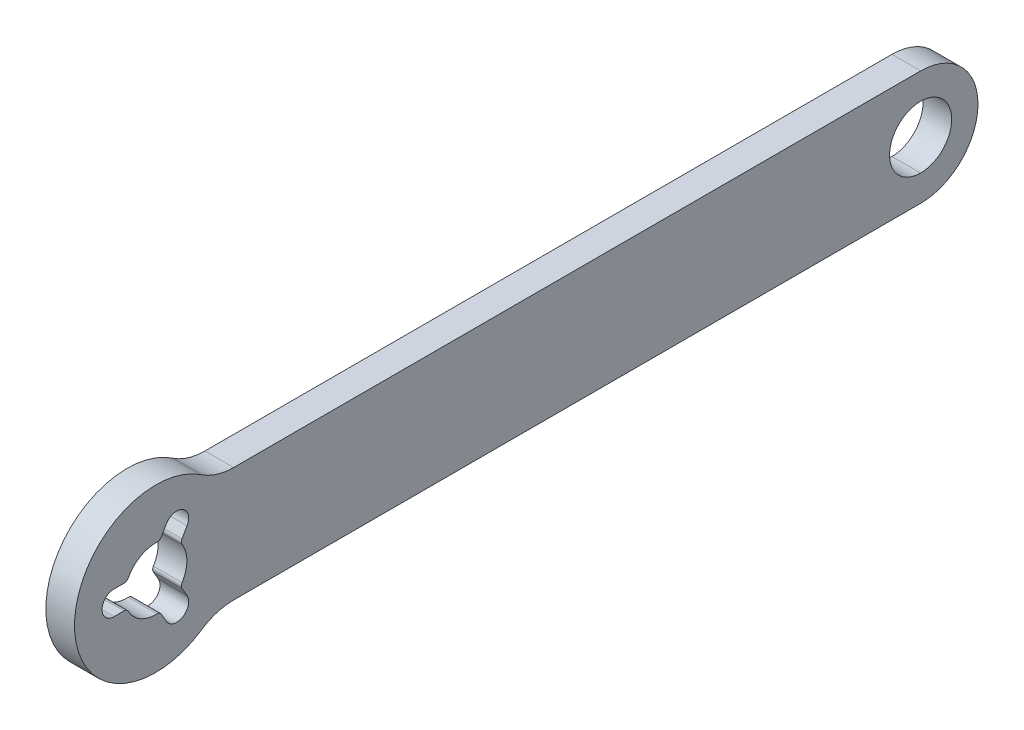
ISO-10303-21;
HEADER;
FILE_DESCRIPTION(('STEP AP214'),'2;1');
FILE_NAME('part.step','',(''),(''),'','','');
FILE_SCHEMA(('AUTOMOTIVE_DESIGN { 1 0 10303 214 1 1 1 1 }'));
ENDSEC;
DATA;
#1=APPLICATION_CONTEXT('core data for automotive mechanical design processes');
#2=APPLICATION_PROTOCOL_DEFINITION('international standard','automotive_design',2000,#1);
#3=PRODUCT_CONTEXT('',#1,'mechanical');
#4=PRODUCT('Part','Part','',(#3));
#5=PRODUCT_RELATED_PRODUCT_CATEGORY('part','',(#4));
#6=PRODUCT_DEFINITION_FORMATION('','',#4);
#7=PRODUCT_DEFINITION_CONTEXT('part definition',#1,'design');
#8=PRODUCT_DEFINITION('design','',#6,#7);
#9=PRODUCT_DEFINITION_SHAPE('','',#8);
#10=(LENGTH_UNIT() NAMED_UNIT(*) SI_UNIT(.MILLI.,.METRE.));
#11=(NAMED_UNIT(*) PLANE_ANGLE_UNIT() SI_UNIT($,.RADIAN.));
#12=(NAMED_UNIT(*) SI_UNIT($,.STERADIAN.) SOLID_ANGLE_UNIT());
#13=UNCERTAINTY_MEASURE_WITH_UNIT(LENGTH_MEASURE(1.E-05),#10,'distance_accuracy_value','');
#14=(GEOMETRIC_REPRESENTATION_CONTEXT(3) GLOBAL_UNCERTAINTY_ASSIGNED_CONTEXT((#13)) GLOBAL_UNIT_ASSIGNED_CONTEXT((#10,
#11,#12)) REPRESENTATION_CONTEXT('',''));
#15=CARTESIAN_POINT('',(0.,0.,0.));
#16=DIRECTION('',(0.,0.,1.));
#17=DIRECTION('',(1.,0.,0.));
#18=AXIS2_PLACEMENT_3D('',#15,#16,#17);
#19=CARTESIAN_POINT('',(-3.,0.,0.));
#20=DIRECTION('',(-1.,0.,0.));
#21=DIRECTION('',(0.,0.,-1.));
#22=AXIS2_PLACEMENT_3D('',#19,#20,#21);
#23=CYLINDRICAL_SURFACE('',#22,6.5);
#24=CARTESIAN_POINT('',(-3.,0.,0.));
#25=DIRECTION('',(1.,0.,0.));
#26=DIRECTION('',(0.,-0.532608352871737,-0.846361827146791));
#27=AXIS2_PLACEMENT_3D('',#24,#25,#26);
#28=CIRCLE('',#27,6.5);
#29=CARTESIAN_POINT('',(-3.,-3.46195429366629,-5.50135187645414));
#30=VERTEX_POINT('',#29);
#31=CARTESIAN_POINT('',(-3.,3.46195429366629,-5.50135187645415));
#32=VERTEX_POINT('',#31);
#33=EDGE_CURVE('E54',#30,#32,#28,.T.);
#34=ORIENTED_EDGE('',*,*,#33,.F.);
#35=DIRECTION('',(1.,0.,0.));
#36=VECTOR('',#35,1.);
#37=CARTESIAN_POINT('',(-3.,-3.46195429366629,-5.50135187645414));
#38=LINE('',#37,#36);
#39=CARTESIAN_POINT('',(3.,-3.46195429366629,-5.50135187645414));
#40=VERTEX_POINT('',#39);
#41=EDGE_CURVE('E11',#30,#40,#38,.T.);
#42=ORIENTED_EDGE('',*,*,#41,.T.);
#43=CARTESIAN_POINT('',(3.,0.,0.));
#44=DIRECTION('',(-1.,0.,0.));
#45=DIRECTION('',(0.,0.532608352871737,-0.846361827146792));
#46=AXIS2_PLACEMENT_3D('',#43,#44,#45);
#47=CIRCLE('',#46,6.5);
#48=CARTESIAN_POINT('',(3.,3.46195429366629,-5.50135187645415));
#49=VERTEX_POINT('',#48);
#50=EDGE_CURVE('E244',#49,#40,#47,.T.);
#51=ORIENTED_EDGE('',*,*,#50,.F.);
#52=DIRECTION('',(-1.,0.,0.));
#53=VECTOR('',#52,1.);
#54=CARTESIAN_POINT('',(3.,3.46195429366629,-5.50135187645415));
#55=LINE('',#54,#53);
#56=EDGE_CURVE('E437',#49,#32,#55,.T.);
#57=ORIENTED_EDGE('',*,*,#56,.T.);
#58=EDGE_LOOP('',(#34,#42,#51,#57));
#59=FACE_BOUND('',#58,.T.);
#60=ADVANCED_FACE('F51',(#59),#23,.F.);
#61=CARTESIAN_POINT('',(-10.8216,-3.99456264653803,-6.34771370360093));
#62=DIRECTION('',(1.,0.,0.));
#63=DIRECTION('',(0.,0.532608352871736,0.846361827146792));
#64=AXIS2_PLACEMENT_3D('',#61,#62,#63);
#65=CYLINDRICAL_SURFACE('',#64,1.);
#66=ORIENTED_EDGE('',*,*,#41,.F.);
#67=CARTESIAN_POINT('',(-3.,-3.99456264653803,-6.34771370360093));
#68=DIRECTION('',(-1.,0.,0.));
#69=DIRECTION('',(0.,-0.499999999999998,0.86602540378444));
#70=AXIS2_PLACEMENT_3D('',#67,#68,#69);
#71=CIRCLE('',#70,1.);
#72=CARTESIAN_POINT('',(-3.,-4.49456264653803,-5.48168829981649));
#73=VERTEX_POINT('',#72);
#74=EDGE_CURVE('E261',#73,#30,#71,.T.);
#75=ORIENTED_EDGE('',*,*,#74,.F.);
#76=DIRECTION('',(1.,0.,0.));
#77=VECTOR('',#76,1.);
#78=CARTESIAN_POINT('',(-3.,-4.49456264653803,-5.4816882998165));
#79=LINE('',#78,#77);
#80=CARTESIAN_POINT('',(3.,-4.49456264653803,-5.48168829981649));
#81=VERTEX_POINT('',#80);
#82=EDGE_CURVE('E60',#73,#81,#79,.T.);
#83=ORIENTED_EDGE('',*,*,#82,.T.);
#84=CARTESIAN_POINT('',(3.,-3.99456264653803,-6.34771370360093));
#85=DIRECTION('',(1.,0.,0.));
#86=DIRECTION('',(0.,0.532608352871737,0.846361827146792));
#87=AXIS2_PLACEMENT_3D('',#84,#85,#86);
#88=CIRCLE('',#87,1.);
#89=EDGE_CURVE('E427',#40,#81,#88,.T.);
#90=ORIENTED_EDGE('',*,*,#89,.F.);
#91=EDGE_LOOP('',(#66,#75,#83,#90));
#92=FACE_BOUND('',#91,.T.);
#93=ADVANCED_FACE('F522',(#92),#65,.T.);
#94=CARTESIAN_POINT('',(3.,-6.32772228311384,-6.54006350946109));
#95=DIRECTION('',(0.,0.5,-0.866025403784439));
#96=DIRECTION('',(0.,0.866025403784439,0.5));
#97=AXIS2_PLACEMENT_3D('',#94,#95,#96);
#98=PLANE('',#97);
#99=DIRECTION('',(0.,0.866025403784439,0.5));
#100=VECTOR('',#99,1.);
#101=CARTESIAN_POINT('',(-3.,-6.32772228311384,-6.5400635094611));
#102=LINE('',#101,#100);
#103=CARTESIAN_POINT('',(-3.,-6.32772228311384,-6.5400635094611));
#104=VERTEX_POINT('',#103);
#105=EDGE_CURVE('E265',#104,#73,#102,.T.);
#106=ORIENTED_EDGE('',*,*,#105,.F.);
#107=DIRECTION('',(-1.,0.,0.));
#108=VECTOR('',#107,1.);
#109=CARTESIAN_POINT('',(3.,-6.32772228311384,-6.5400635094611));
#110=LINE('',#109,#108);
#111=CARTESIAN_POINT('',(3.,-6.32772228311384,-6.5400635094611));
#112=VERTEX_POINT('',#111);
#113=EDGE_CURVE('E496',#112,#104,#110,.T.);
#114=ORIENTED_EDGE('',*,*,#113,.F.);
#115=DIRECTION('',(0.,0.866025403784439,0.499999999999999));
#116=VECTOR('',#115,1.);
#117=CARTESIAN_POINT('',(3.,-6.32772228311385,-6.5400635094611));
#118=LINE('',#117,#116);
#119=EDGE_CURVE('E423',#112,#81,#118,.T.);
#120=ORIENTED_EDGE('',*,*,#119,.T.);
#121=ORIENTED_EDGE('',*,*,#82,.F.);
#122=EDGE_LOOP('',(#106,#114,#120,#121));
#123=FACE_BOUND('',#122,.T.);
#124=ADVANCED_FACE('F525',(#123),#98,.F.);
#125=CARTESIAN_POINT('',(3.,-7.57772228311384,-4.375));
#126=DIRECTION('',(1.,0.,0.));
#127=DIRECTION('',(0.,-0.866025403784439,-0.5));
#128=AXIS2_PLACEMENT_3D('',#125,#126,#127);
#129=CYLINDRICAL_SURFACE('',#128,2.5);
#130=DIRECTION('',(-1.,0.,0.));
#131=VECTOR('',#130,1.);
#132=CARTESIAN_POINT('',(3.,-8.82772228311384,-2.2099364905389));
#133=LINE('',#132,#131);
#134=CARTESIAN_POINT('',(3.,-8.82772228311384,-2.2099364905389));
#135=VERTEX_POINT('',#134);
#136=CARTESIAN_POINT('',(-3.,-8.82772228311384,-2.2099364905389));
#137=VERTEX_POINT('',#136);
#138=EDGE_CURVE('E492',#135,#137,#133,.T.);
#139=ORIENTED_EDGE('',*,*,#138,.F.);
#140=CARTESIAN_POINT('',(3.,-7.57772228311384,-4.375));
#141=DIRECTION('',(1.,0.,0.));
#142=DIRECTION('',(0.,-0.5,0.866025403784439));
#143=AXIS2_PLACEMENT_3D('',#140,#141,#142);
#144=CIRCLE('',#143,2.5);
#145=EDGE_CURVE('E419',#135,#112,#144,.T.);
#146=ORIENTED_EDGE('',*,*,#145,.T.);
#147=ORIENTED_EDGE('',*,*,#113,.T.);
#148=CARTESIAN_POINT('',(-3.,-7.57772228311384,-4.375));
#149=DIRECTION('',(1.,0.,0.));
#150=DIRECTION('',(0.,-0.5,0.866025403784438));
#151=AXIS2_PLACEMENT_3D('',#148,#149,#150);
#152=CIRCLE('',#151,2.5);
#153=EDGE_CURVE('E269',#137,#104,#152,.T.);
#154=ORIENTED_EDGE('',*,*,#153,.F.);
#155=EDGE_LOOP('',(#139,#146,#147,#154));
#156=FACE_BOUND('',#155,.T.);
#157=ADVANCED_FACE('F529',(#156),#129,.F.);
#158=CARTESIAN_POINT('',(3.,-6.44615242270663,-0.834936490538902));
#159=DIRECTION('',(0.,-0.5,0.866025403784439));
#160=DIRECTION('',(0.,-0.866025403784439,-0.5));
#161=AXIS2_PLACEMENT_3D('',#158,#159,#160);
#162=PLANE('',#161);
#163=DIRECTION('',(0.,-0.866025403784439,-0.5));
#164=VECTOR('',#163,1.);
#165=CARTESIAN_POINT('',(3.,-6.99456264653803,-1.1515612808943));
#166=LINE('',#165,#164);
#167=CARTESIAN_POINT('',(3.,-6.99456264653803,-1.1515612808943));
#168=VERTEX_POINT('',#167);
#169=EDGE_CURVE('E415',#168,#135,#166,.T.);
#170=ORIENTED_EDGE('',*,*,#169,.T.);
#171=ORIENTED_EDGE('',*,*,#138,.T.);
#172=DIRECTION('',(0.,-0.866025403784439,-0.5));
#173=VECTOR('',#172,1.);
#174=CARTESIAN_POINT('',(-3.,-6.99456264653803,-1.1515612808943));
#175=LINE('',#174,#173);
#176=CARTESIAN_POINT('',(-3.,-6.99456264653803,-1.1515612808943));
#177=VERTEX_POINT('',#176);
#178=EDGE_CURVE('E273',#177,#137,#175,.T.);
#179=ORIENTED_EDGE('',*,*,#178,.F.);
#180=DIRECTION('',(-1.,0.,0.));
#181=VECTOR('',#180,1.);
#182=CARTESIAN_POINT('',(3.,-6.99456264653803,-1.1515612808943));
#183=LINE('',#182,#181);
#184=EDGE_CURVE('E480',#168,#177,#183,.T.);
#185=ORIENTED_EDGE('',*,*,#184,.F.);
#186=EDGE_LOOP('',(#170,#171,#179,#185));
#187=FACE_BOUND('',#186,.T.);
#188=ADVANCED_FACE('F531',(#187),#162,.F.);
#189=CARTESIAN_POINT('',(10.8216,-7.49456264653803,-0.285535877109864));
#190=DIRECTION('',(-1.,0.,0.));
#191=DIRECTION('',(0.,0.999275019538404,0.0380714502813137));
#192=AXIS2_PLACEMENT_3D('',#189,#190,#191);
#193=CYLINDRICAL_SURFACE('',#192,1.);
#194=DIRECTION('',(-1.,0.,0.));
#195=VECTOR('',#194,1.);
#196=CARTESIAN_POINT('',(3.,-6.49528762699963,-0.24746442682855));
#197=LINE('',#196,#195);
#198=CARTESIAN_POINT('',(3.,-6.49528762699963,-0.247464426828549));
#199=VERTEX_POINT('',#198);
#200=CARTESIAN_POINT('',(-3.,-6.49528762699963,-0.247464426828549));
#201=VERTEX_POINT('',#200);
#202=EDGE_CURVE('E476',#199,#201,#197,.T.);
#203=ORIENTED_EDGE('',*,*,#202,.F.);
#204=CARTESIAN_POINT('',(3.,-7.49456264653803,-0.285535877109864));
#205=DIRECTION('',(1.,0.,0.));
#206=DIRECTION('',(0.,0.499999999999999,-0.866025403784439));
#207=AXIS2_PLACEMENT_3D('',#204,#205,#206);
#208=CIRCLE('',#207,1.);
#209=EDGE_CURVE('E411',#168,#199,#208,.T.);
#210=ORIENTED_EDGE('',*,*,#209,.F.);
#211=ORIENTED_EDGE('',*,*,#184,.T.);
#212=CARTESIAN_POINT('',(-3.,-7.49456264653803,-0.285535877109864));
#213=DIRECTION('',(-1.,0.,0.));
#214=DIRECTION('',(0.,0.999275019538404,0.0380714502813151));
#215=AXIS2_PLACEMENT_3D('',#212,#213,#214);
#216=CIRCLE('',#215,1.);
#217=EDGE_CURVE('E277',#201,#177,#216,.T.);
#218=ORIENTED_EDGE('',*,*,#217,.F.);
#219=EDGE_LOOP('',(#203,#210,#211,#218));
#220=FACE_BOUND('',#219,.T.);
#221=ADVANCED_FACE('F534',(#220),#193,.T.);
#222=CARTESIAN_POINT('',(-3.,0.,0.));
#223=DIRECTION('',(-1.,0.,0.));
#224=DIRECTION('',(0.,0.,-1.));
#225=AXIS2_PLACEMENT_3D('',#222,#223,#224);
#226=CYLINDRICAL_SURFACE('',#225,6.5);
#227=CARTESIAN_POINT('',(-3.,0.,0.));
#228=DIRECTION('',(1.,0.,0.));
#229=DIRECTION('',(0.,-0.466666666666667,0.884433277428107));
#230=AXIS2_PLACEMENT_3D('',#227,#228,#229);
#231=CIRCLE('',#230,6.5);
#232=CARTESIAN_POINT('',(-3.,-3.03333333333333,5.74881630328269));
#233=VERTEX_POINT('',#232);
#234=EDGE_CURVE('E281',#233,#201,#231,.T.);
#235=ORIENTED_EDGE('',*,*,#234,.F.);
#236=DIRECTION('',(1.,0.,0.));
#237=VECTOR('',#236,1.);
#238=CARTESIAN_POINT('',(-3.,-3.03333333333333,5.74881630328269));
#239=LINE('',#238,#237);
#240=CARTESIAN_POINT('',(3.,-3.03333333333333,5.74881630328269));
#241=VERTEX_POINT('',#240);
#242=EDGE_CURVE('E472',#233,#241,#239,.T.);
#243=ORIENTED_EDGE('',*,*,#242,.T.);
#244=CARTESIAN_POINT('',(3.,0.,0.));
#245=DIRECTION('',(-1.,0.,0.));
#246=DIRECTION('',(0.,-0.999275019538404,-0.0380714502813152));
#247=AXIS2_PLACEMENT_3D('',#244,#245,#246);
#248=CIRCLE('',#247,6.5);
#249=EDGE_CURVE('E410',#199,#241,#248,.T.);
#250=ORIENTED_EDGE('',*,*,#249,.F.);
#251=ORIENTED_EDGE('',*,*,#202,.T.);
#252=EDGE_LOOP('',(#235,#243,#250,#251));
#253=FACE_BOUND('',#252,.T.);
#254=ADVANCED_FACE('F539',(#253),#226,.F.);
#255=CARTESIAN_POINT('',(-10.8216,-3.5,6.6332495807108));
#256=DIRECTION('',(1.,0.,0.));
#257=DIRECTION('',(0.,0.466666666666667,-0.884433277428106));
#258=AXIS2_PLACEMENT_3D('',#255,#256,#257);
#259=CYLINDRICAL_SURFACE('',#258,1.);
#260=ORIENTED_EDGE('',*,*,#242,.F.);
#261=CARTESIAN_POINT('',(-3.,-3.5,6.6332495807108));
#262=DIRECTION('',(-1.,0.,0.));
#263=DIRECTION('',(0.,1.,0.));
#264=AXIS2_PLACEMENT_3D('',#261,#262,#263);
#265=CIRCLE('',#264,1.);
#266=CARTESIAN_POINT('',(-3.,-2.5,6.6332495807108));
#267=VERTEX_POINT('',#266);
#268=EDGE_CURVE('E282',#267,#233,#265,.T.);
#269=ORIENTED_EDGE('',*,*,#268,.F.);
#270=DIRECTION('',(1.,0.,0.));
#271=VECTOR('',#270,1.);
#272=CARTESIAN_POINT('',(-3.,-2.5,6.6332495807108));
#273=LINE('',#272,#271);
#274=CARTESIAN_POINT('',(3.,-2.5,6.6332495807108));
#275=VERTEX_POINT('',#274);
#276=EDGE_CURVE('E469',#267,#275,#273,.T.);
#277=ORIENTED_EDGE('',*,*,#276,.T.);
#278=CARTESIAN_POINT('',(3.,-3.5,6.6332495807108));
#279=DIRECTION('',(1.,0.,0.));
#280=DIRECTION('',(0.,0.466666666666666,-0.884433277428107));
#281=AXIS2_PLACEMENT_3D('',#278,#279,#280);
#282=CIRCLE('',#281,1.);
#283=EDGE_CURVE('E406',#241,#275,#282,.T.);
#284=ORIENTED_EDGE('',*,*,#283,.F.);
#285=EDGE_LOOP('',(#260,#269,#277,#284));
#286=FACE_BOUND('',#285,.T.);
#287=ADVANCED_FACE('F542',(#286),#259,.T.);
#288=CARTESIAN_POINT('',(3.,-2.5,8.75));
#289=DIRECTION('',(0.,-1.,0.));
#290=DIRECTION('',(0.,0.,-1.));
#291=AXIS2_PLACEMENT_3D('',#288,#289,#290);
#292=PLANE('',#291);
#293=DIRECTION('',(0.,0.,-1.));
#294=VECTOR('',#293,1.);
#295=CARTESIAN_POINT('',(-3.,-2.5,8.75));
#296=LINE('',#295,#294);
#297=CARTESIAN_POINT('',(-3.,-2.5,8.75));
#298=VERTEX_POINT('',#297);
#299=EDGE_CURVE('E286',#298,#267,#296,.T.);
#300=ORIENTED_EDGE('',*,*,#299,.F.);
#301=DIRECTION('',(-1.,0.,0.));
#302=VECTOR('',#301,1.);
#303=CARTESIAN_POINT('',(3.,-2.5,8.75));
#304=LINE('',#303,#302);
#305=CARTESIAN_POINT('',(3.,-2.5,8.75));
#306=VERTEX_POINT('',#305);
#307=EDGE_CURVE('E468',#306,#298,#304,.T.);
#308=ORIENTED_EDGE('',*,*,#307,.F.);
#309=DIRECTION('',(0.,0.,-1.));
#310=VECTOR('',#309,1.);
#311=CARTESIAN_POINT('',(3.,-2.5,8.75));
#312=LINE('',#311,#310);
#313=EDGE_CURVE('E402',#306,#275,#312,.T.);
#314=ORIENTED_EDGE('',*,*,#313,.T.);
#315=ORIENTED_EDGE('',*,*,#276,.F.);
#316=EDGE_LOOP('',(#300,#308,#314,#315));
#317=FACE_BOUND('',#316,.T.);
#318=ADVANCED_FACE('F545',(#317),#292,.F.);
#319=CARTESIAN_POINT('',(3.,0.,8.75));
#320=DIRECTION('',(1.,0.,0.));
#321=DIRECTION('',(0.,0.,1.));
#322=AXIS2_PLACEMENT_3D('',#319,#320,#321);
#323=CYLINDRICAL_SURFACE('',#322,2.5);
#324=DIRECTION('',(-1.,0.,0.));
#325=VECTOR('',#324,1.);
#326=CARTESIAN_POINT('',(3.,2.5,8.75));
#327=LINE('',#326,#325);
#328=CARTESIAN_POINT('',(3.,2.5,8.75));
#329=VERTEX_POINT('',#328);
#330=CARTESIAN_POINT('',(-3.,2.5,8.75));
#331=VERTEX_POINT('',#330);
#332=EDGE_CURVE('E464',#329,#331,#327,.T.);
#333=ORIENTED_EDGE('',*,*,#332,.F.);
#334=CARTESIAN_POINT('',(3.,0.,8.75));
#335=DIRECTION('',(1.,0.,0.));
#336=DIRECTION('',(0.,1.,0.));
#337=AXIS2_PLACEMENT_3D('',#334,#335,#336);
#338=CIRCLE('',#337,2.5);
#339=EDGE_CURVE('E398',#329,#306,#338,.T.);
#340=ORIENTED_EDGE('',*,*,#339,.T.);
#341=ORIENTED_EDGE('',*,*,#307,.T.);
#342=CARTESIAN_POINT('',(-3.,0.,8.75));
#343=DIRECTION('',(1.,0.,0.));
#344=DIRECTION('',(0.,1.,0.));
#345=AXIS2_PLACEMENT_3D('',#342,#343,#344);
#346=CIRCLE('',#345,2.5);
#347=EDGE_CURVE('E290',#331,#298,#346,.T.);
#348=ORIENTED_EDGE('',*,*,#347,.F.);
#349=EDGE_LOOP('',(#333,#340,#341,#348));
#350=FACE_BOUND('',#349,.T.);
#351=ADVANCED_FACE('F549',(#350),#323,.F.);
#352=CARTESIAN_POINT('',(3.,2.5,6.));
#353=DIRECTION('',(0.,1.,0.));
#354=DIRECTION('',(0.,0.,1.));
#355=AXIS2_PLACEMENT_3D('',#352,#353,#354);
#356=PLANE('',#355);
#357=DIRECTION('',(0.,0.,1.));
#358=VECTOR('',#357,1.);
#359=CARTESIAN_POINT('',(3.,2.5,6.6332495807108));
#360=LINE('',#359,#358);
#361=CARTESIAN_POINT('',(3.,2.5,6.6332495807108));
#362=VERTEX_POINT('',#361);
#363=EDGE_CURVE('E394',#362,#329,#360,.T.);
#364=ORIENTED_EDGE('',*,*,#363,.T.);
#365=ORIENTED_EDGE('',*,*,#332,.T.);
#366=DIRECTION('',(0.,0.,1.));
#367=VECTOR('',#366,1.);
#368=CARTESIAN_POINT('',(-3.,2.5,6.6332495807108));
#369=LINE('',#368,#367);
#370=CARTESIAN_POINT('',(-3.,2.5,6.6332495807108));
#371=VERTEX_POINT('',#370);
#372=EDGE_CURVE('E294',#371,#331,#369,.T.);
#373=ORIENTED_EDGE('',*,*,#372,.F.);
#374=DIRECTION('',(-1.,0.,0.));
#375=VECTOR('',#374,1.);
#376=CARTESIAN_POINT('',(3.,2.5,6.6332495807108));
#377=LINE('',#376,#375);
#378=EDGE_CURVE('E457',#362,#371,#377,.T.);
#379=ORIENTED_EDGE('',*,*,#378,.F.);
#380=EDGE_LOOP('',(#364,#365,#373,#379));
#381=FACE_BOUND('',#380,.T.);
#382=ADVANCED_FACE('F551',(#381),#356,.F.);
#383=CARTESIAN_POINT('',(10.8216,3.5,6.6332495807108));
#384=DIRECTION('',(-1.,0.,0.));
#385=DIRECTION('',(0.,-0.466666666666665,-0.884433277428108));
#386=AXIS2_PLACEMENT_3D('',#383,#384,#385);
#387=CYLINDRICAL_SURFACE('',#386,1.);
#388=DIRECTION('',(-1.,0.,0.));
#389=VECTOR('',#388,1.);
#390=CARTESIAN_POINT('',(3.,3.03333333333333,5.74881630328269));
#391=LINE('',#390,#389);
#392=CARTESIAN_POINT('',(3.,3.03333333333333,5.74881630328269));
#393=VERTEX_POINT('',#392);
#394=CARTESIAN_POINT('',(-3.,3.03333333333333,5.74881630328269));
#395=VERTEX_POINT('',#394);
#396=EDGE_CURVE('E452',#393,#395,#391,.T.);
#397=ORIENTED_EDGE('',*,*,#396,.F.);
#398=CARTESIAN_POINT('',(3.,3.5,6.6332495807108));
#399=DIRECTION('',(1.,0.,0.));
#400=DIRECTION('',(0.,-1.,0.));
#401=AXIS2_PLACEMENT_3D('',#398,#399,#400);
#402=CIRCLE('',#401,1.);
#403=EDGE_CURVE('E390',#362,#393,#402,.T.);
#404=ORIENTED_EDGE('',*,*,#403,.F.);
#405=ORIENTED_EDGE('',*,*,#378,.T.);
#406=CARTESIAN_POINT('',(-3.,3.5,6.6332495807108));
#407=DIRECTION('',(-1.,0.,0.));
#408=DIRECTION('',(0.,-0.46666666666667,-0.884433277428105));
#409=AXIS2_PLACEMENT_3D('',#406,#407,#408);
#410=CIRCLE('',#409,1.);
#411=EDGE_CURVE('E298',#395,#371,#410,.T.);
#412=ORIENTED_EDGE('',*,*,#411,.F.);
#413=EDGE_LOOP('',(#397,#404,#405,#412));
#414=FACE_BOUND('',#413,.T.);
#415=ADVANCED_FACE('F554',(#414),#387,.T.);
#416=CARTESIAN_POINT('',(-3.,0.,0.));
#417=DIRECTION('',(-1.,0.,0.));
#418=DIRECTION('',(0.,0.,-1.));
#419=AXIS2_PLACEMENT_3D('',#416,#417,#418);
#420=CYLINDRICAL_SURFACE('',#419,6.5);
#421=CARTESIAN_POINT('',(3.,0.,0.));
#422=DIRECTION('',(-1.,0.,0.));
#423=DIRECTION('',(0.,0.466666666666666,0.884433277428107));
#424=AXIS2_PLACEMENT_3D('',#421,#422,#423);
#425=CIRCLE('',#424,6.5);
#426=CARTESIAN_POINT('',(3.,6.49528762699963,-0.247464426828551));
#427=VERTEX_POINT('',#426);
#428=EDGE_CURVE('E389',#393,#427,#425,.T.);
#429=ORIENTED_EDGE('',*,*,#428,.F.);
#430=ORIENTED_EDGE('',*,*,#396,.T.);
#431=CARTESIAN_POINT('',(-3.,0.,0.));
#432=DIRECTION('',(1.,0.,0.));
#433=DIRECTION('',(0.,0.999275019538404,-0.0380714502813157));
#434=AXIS2_PLACEMENT_3D('',#431,#432,#433);
#435=CIRCLE('',#434,6.5);
#436=CARTESIAN_POINT('',(-3.,6.49528762699963,-0.247464426828551));
#437=VERTEX_POINT('',#436);
#438=EDGE_CURVE('E67',#437,#395,#435,.T.);
#439=ORIENTED_EDGE('',*,*,#438,.F.);
#440=DIRECTION('',(1.,0.,0.));
#441=VECTOR('',#440,1.);
#442=CARTESIAN_POINT('',(-3.,6.49528762699963,-0.24746442682855));
#443=LINE('',#442,#441);
#444=EDGE_CURVE('E446',#437,#427,#443,.T.);
#445=ORIENTED_EDGE('',*,*,#444,.T.);
#446=EDGE_LOOP('',(#429,#430,#439,#445));
#447=FACE_BOUND('',#446,.T.);
#448=ADVANCED_FACE('F558',(#447),#420,.F.);
#449=CARTESIAN_POINT('',(-10.8216,7.49456264653803,-0.285535877109868));
#450=DIRECTION('',(1.,0.,0.));
#451=DIRECTION('',(0.,-0.999275019538404,0.0380714502813174));
#452=AXIS2_PLACEMENT_3D('',#449,#450,#451);
#453=CYLINDRICAL_SURFACE('',#452,1.);
#454=ORIENTED_EDGE('',*,*,#444,.F.);
#455=CARTESIAN_POINT('',(-3.,7.49456264653803,-0.285535877109868));
#456=DIRECTION('',(-1.,0.,0.));
#457=DIRECTION('',(0.,-0.5,-0.866025403784439));
#458=AXIS2_PLACEMENT_3D('',#455,#456,#457);
#459=CIRCLE('',#458,1.);
#460=CARTESIAN_POINT('',(-3.,6.99456264653803,-1.15156128089431));
#461=VERTEX_POINT('',#460);
#462=EDGE_CURVE('E74',#461,#437,#459,.T.);
#463=ORIENTED_EDGE('',*,*,#462,.F.);
#464=DIRECTION('',(1.,0.,0.));
#465=VECTOR('',#464,1.);
#466=CARTESIAN_POINT('',(-3.,6.99456264653803,-1.15156128089431));
#467=LINE('',#466,#465);
#468=CARTESIAN_POINT('',(3.,6.99456264653803,-1.15156128089431));
#469=VERTEX_POINT('',#468);
#470=EDGE_CURVE('E443',#461,#469,#467,.T.);
#471=ORIENTED_EDGE('',*,*,#470,.T.);
#472=CARTESIAN_POINT('',(3.,7.49456264653803,-0.285535877109868));
#473=DIRECTION('',(1.,0.,0.));
#474=DIRECTION('',(0.,-0.999275019538404,0.0380714502813161));
#475=AXIS2_PLACEMENT_3D('',#472,#473,#474);
#476=CIRCLE('',#475,1.);
#477=EDGE_CURVE('E385',#427,#469,#476,.T.);
#478=ORIENTED_EDGE('',*,*,#477,.F.);
#479=EDGE_LOOP('',(#454,#463,#471,#478));
#480=FACE_BOUND('',#479,.T.);
#481=ADVANCED_FACE('F559',(#480),#453,.T.);
#482=CARTESIAN_POINT('',(3.,8.82772228311384,-2.20993649053891));
#483=DIRECTION('',(0.,0.5,0.866025403784438));
#484=DIRECTION('',(0.,-0.866025403784438,0.5));
#485=AXIS2_PLACEMENT_3D('',#482,#483,#484);
#486=PLANE('',#485);
#487=DIRECTION('',(0.,-0.866025403784438,0.5));
#488=VECTOR('',#487,1.);
#489=CARTESIAN_POINT('',(-3.,8.82772228311383,-2.2099364905389));
#490=LINE('',#489,#488);
#491=CARTESIAN_POINT('',(-3.,8.82772228311384,-2.20993649053891));
#492=VERTEX_POINT('',#491);
#493=EDGE_CURVE('E304',#492,#461,#490,.T.);
#494=ORIENTED_EDGE('',*,*,#493,.F.);
#495=DIRECTION('',(-1.,0.,0.));
#496=VECTOR('',#495,1.);
#497=CARTESIAN_POINT('',(3.,8.82772228311384,-2.20993649053891));
#498=LINE('',#497,#496);
#499=CARTESIAN_POINT('',(3.,8.82772228311384,-2.20993649053891));
#500=VERTEX_POINT('',#499);
#501=EDGE_CURVE('E442',#500,#492,#498,.T.);
#502=ORIENTED_EDGE('',*,*,#501,.F.);
#503=DIRECTION('',(0.,-0.866025403784438,0.500000000000001));
#504=VECTOR('',#503,1.);
#505=CARTESIAN_POINT('',(3.,8.82772228311384,-2.20993649053891));
#506=LINE('',#505,#504);
#507=EDGE_CURVE('E381',#500,#469,#506,.T.);
#508=ORIENTED_EDGE('',*,*,#507,.T.);
#509=ORIENTED_EDGE('',*,*,#470,.F.);
#510=EDGE_LOOP('',(#494,#502,#508,#509));
#511=FACE_BOUND('',#510,.T.);
#512=ADVANCED_FACE('F561',(#511),#486,.F.);
#513=CARTESIAN_POINT('',(3.,7.57772228311384,-4.375));
#514=DIRECTION('',(1.,0.,0.));
#515=DIRECTION('',(0.,0.866025403784438,-0.5));
#516=AXIS2_PLACEMENT_3D('',#513,#514,#515);
#517=CYLINDRICAL_SURFACE('',#516,2.5);
#518=DIRECTION('',(-1.,0.,0.));
#519=VECTOR('',#518,1.);
#520=CARTESIAN_POINT('',(3.,6.32772228311384,-6.5400635094611));
#521=LINE('',#520,#519);
#522=CARTESIAN_POINT('',(3.,6.32772228311383,-6.5400635094611));
#523=VERTEX_POINT('',#522);
#524=CARTESIAN_POINT('',(-3.,6.32772228311383,-6.5400635094611));
#525=VERTEX_POINT('',#524);
#526=EDGE_CURVE('E438',#523,#525,#521,.T.);
#527=ORIENTED_EDGE('',*,*,#526,.F.);
#528=CARTESIAN_POINT('',(3.,7.57772228311384,-4.375));
#529=DIRECTION('',(1.,0.,0.));
#530=DIRECTION('',(0.,-0.500000000000003,-0.866025403784437));
#531=AXIS2_PLACEMENT_3D('',#528,#529,#530);
#532=CIRCLE('',#531,2.5);
#533=EDGE_CURVE('E377',#523,#500,#532,.T.);
#534=ORIENTED_EDGE('',*,*,#533,.T.);
#535=ORIENTED_EDGE('',*,*,#501,.T.);
#536=CARTESIAN_POINT('',(-3.,7.57772228311384,-4.375));
#537=DIRECTION('',(1.,0.,0.));
#538=DIRECTION('',(0.,-0.500000000000003,-0.866025403784437));
#539=AXIS2_PLACEMENT_3D('',#536,#537,#538);
#540=CIRCLE('',#539,2.5);
#541=EDGE_CURVE('E308',#525,#492,#540,.T.);
#542=ORIENTED_EDGE('',*,*,#541,.F.);
#543=EDGE_LOOP('',(#527,#534,#535,#542));
#544=FACE_BOUND('',#543,.T.);
#545=ADVANCED_FACE('F564',(#544),#517,.F.);
#546=CARTESIAN_POINT('',(3.,3.94615242270663,-5.1650635094611));
#547=DIRECTION('',(0.,-0.5,-0.866025403784438));
#548=DIRECTION('',(0.,0.866025403784438,-0.5));
#549=AXIS2_PLACEMENT_3D('',#546,#547,#548);
#550=PLANE('',#549);
#551=DIRECTION('',(0.,0.866025403784438,-0.5));
#552=VECTOR('',#551,1.);
#553=CARTESIAN_POINT('',(3.,4.49456264653803,-5.4816882998165));
#554=LINE('',#553,#552);
#555=CARTESIAN_POINT('',(3.,4.49456264653803,-5.4816882998165));
#556=VERTEX_POINT('',#555);
#557=EDGE_CURVE('E373',#556,#523,#554,.T.);
#558=ORIENTED_EDGE('',*,*,#557,.T.);
#559=ORIENTED_EDGE('',*,*,#526,.T.);
#560=DIRECTION('',(0.,0.866025403784438,-0.5));
#561=VECTOR('',#560,1.);
#562=CARTESIAN_POINT('',(-3.,4.49456264653803,-5.4816882998165));
#563=LINE('',#562,#561);
#564=CARTESIAN_POINT('',(-3.,4.49456264653803,-5.4816882998165));
#565=VERTEX_POINT('',#564);
#566=EDGE_CURVE('E312',#565,#525,#563,.T.);
#567=ORIENTED_EDGE('',*,*,#566,.F.);
#568=DIRECTION('',(-1.,0.,0.));
#569=VECTOR('',#568,1.);
#570=CARTESIAN_POINT('',(3.,4.49456264653803,-5.4816882998165));
#571=LINE('',#570,#569);
#572=EDGE_CURVE('E433',#556,#565,#571,.T.);
#573=ORIENTED_EDGE('',*,*,#572,.F.);
#574=EDGE_LOOP('',(#558,#559,#567,#573));
#575=FACE_BOUND('',#574,.T.);
#576=ADVANCED_FACE('F566',(#575),#550,.F.);
#577=CARTESIAN_POINT('',(10.8216,3.99456264653803,-6.34771370360094));
#578=DIRECTION('',(-1.,0.,0.));
#579=DIRECTION('',(0.,-0.532608352871737,0.846361827146792));
#580=AXIS2_PLACEMENT_3D('',#577,#578,#579);
#581=CYLINDRICAL_SURFACE('',#580,1.);
#582=ORIENTED_EDGE('',*,*,#56,.F.);
#583=CARTESIAN_POINT('',(3.,3.99456264653803,-6.34771370360094));
#584=DIRECTION('',(1.,0.,0.));
#585=DIRECTION('',(0.,0.5,0.866025403784438));
#586=AXIS2_PLACEMENT_3D('',#583,#584,#585);
#587=CIRCLE('',#586,1.);
#588=EDGE_CURVE('E369',#556,#49,#587,.T.);
#589=ORIENTED_EDGE('',*,*,#588,.F.);
#590=ORIENTED_EDGE('',*,*,#572,.T.);
#591=CARTESIAN_POINT('',(-3.,3.99456264653803,-6.34771370360094));
#592=DIRECTION('',(-1.,0.,0.));
#593=DIRECTION('',(0.,-0.532608352871737,0.846361827146792));
#594=AXIS2_PLACEMENT_3D('',#591,#592,#593);
#595=CIRCLE('',#594,1.);
#596=EDGE_CURVE('E235',#32,#565,#595,.T.);
#597=ORIENTED_EDGE('',*,*,#596,.F.);
#598=EDGE_LOOP('',(#582,#589,#590,#597));
#599=FACE_BOUND('',#598,.T.);
#600=ADVANCED_FACE('F517',(#599),#581,.T.);
#601=CARTESIAN_POINT('',(-3.,0.,-160.));
#602=DIRECTION('',(1.,0.,0.));
#603=DIRECTION('',(0.,-1.,0.));
#604=AXIS2_PLACEMENT_3D('',#601,#602,#603);
#605=CYLINDRICAL_SURFACE('',#604,6.5);
#606=DIRECTION('',(1.,0.,0.));
#607=VECTOR('',#606,1.);
#608=CARTESIAN_POINT('',(-3.,-6.5,-160.));
#609=LINE('',#608,#607);
#610=CARTESIAN_POINT('',(-3.,-6.5,-160.));
#611=VERTEX_POINT('',#610);
#612=CARTESIAN_POINT('',(3.,-6.5,-160.));
#613=VERTEX_POINT('',#612);
#614=EDGE_CURVE('E227',#611,#613,#609,.T.);
#615=ORIENTED_EDGE('',*,*,#614,.T.);
#616=CARTESIAN_POINT('',(3.,0.,-160.));
#617=DIRECTION('',(-1.,0.,0.));
#618=DIRECTION('',(0.,1.,0.));
#619=AXIS2_PLACEMENT_3D('',#616,#617,#618);
#620=CIRCLE('',#619,6.5);
#621=CARTESIAN_POINT('',(3.,6.5,-160.));
#622=VERTEX_POINT('',#621);
#623=EDGE_CURVE('E366',#622,#613,#620,.T.);
#624=ORIENTED_EDGE('',*,*,#623,.F.);
#625=DIRECTION('',(1.,0.,0.));
#626=VECTOR('',#625,1.);
#627=CARTESIAN_POINT('',(-3.,6.5,-160.));
#628=LINE('',#627,#626);
#629=CARTESIAN_POINT('',(-3.,6.5,-160.));
#630=VERTEX_POINT('',#629);
#631=EDGE_CURVE('E230',#630,#622,#628,.T.);
#632=ORIENTED_EDGE('',*,*,#631,.F.);
#633=CARTESIAN_POINT('',(-3.,0.,-160.));
#634=DIRECTION('',(-1.,0.,0.));
#635=DIRECTION('',(0.,1.,0.));
#636=AXIS2_PLACEMENT_3D('',#633,#634,#635);
#637=CIRCLE('',#636,6.5);
#638=EDGE_CURVE('E224',#630,#611,#637,.T.);
#639=ORIENTED_EDGE('',*,*,#638,.T.);
#640=EDGE_LOOP('',(#615,#624,#632,#639));
#641=FACE_BOUND('',#640,.T.);
#642=ADVANCED_FACE('F226',(#641),#605,.F.);
#643=CARTESIAN_POINT('',(-3.,0.,-160.));
#644=DIRECTION('',(1.,0.,0.));
#645=DIRECTION('',(0.,-1.,0.));
#646=AXIS2_PLACEMENT_3D('',#643,#644,#645);
#647=CYLINDRICAL_SURFACE('',#646,6.5);
#648=ORIENTED_EDGE('',*,*,#631,.T.);
#649=CARTESIAN_POINT('',(3.,0.,-160.));
#650=DIRECTION('',(-1.,0.,0.));
#651=DIRECTION('',(0.,-1.,0.));
#652=AXIS2_PLACEMENT_3D('',#649,#650,#651);
#653=CIRCLE('',#652,6.5);
#654=EDGE_CURVE('E241',#613,#622,#653,.T.);
#655=ORIENTED_EDGE('',*,*,#654,.F.);
#656=ORIENTED_EDGE('',*,*,#614,.F.);
#657=CARTESIAN_POINT('',(-3.,0.,-160.));
#658=DIRECTION('',(-1.,0.,0.));
#659=DIRECTION('',(0.,-1.,0.));
#660=AXIS2_PLACEMENT_3D('',#657,#658,#659);
#661=CIRCLE('',#660,6.5);
#662=EDGE_CURVE('E236',#611,#630,#661,.T.);
#663=ORIENTED_EDGE('',*,*,#662,.T.);
#664=EDGE_LOOP('',(#648,#655,#656,#663));
#665=FACE_BOUND('',#664,.T.);
#666=ADVANCED_FACE('F239',(#665),#647,.F.);
#667=CARTESIAN_POINT('',(3.,0.,0.));
#668=DIRECTION('',(1.,0.,0.));
#669=DIRECTION('',(0.,-1.,0.));
#670=AXIS2_PLACEMENT_3D('',#667,#668,#669);
#671=PLANE('',#670);
#672=DIRECTION('',(0.,0.,1.));
#673=VECTOR('',#672,1.);
#674=CARTESIAN_POINT('',(3.,12.,-160.));
#675=LINE('',#674,#673);
#676=CARTESIAN_POINT('',(3.,12.,-160.));
#677=VERTEX_POINT('',#676);
#678=CARTESIAN_POINT('',(3.,12.,-16.2788205960997));
#679=VERTEX_POINT('',#678);
#680=EDGE_CURVE('E336',#677,#679,#675,.T.);
#681=ORIENTED_EDGE('',*,*,#680,.T.);
#682=CARTESIAN_POINT('',(3.,24.,-16.2788205960997));
#683=DIRECTION('',(-1.,0.,0.));
#684=DIRECTION('',(0.,-1.,0.));
#685=AXIS2_PLACEMENT_3D('',#682,#683,#684);
#686=CIRCLE('',#685,12.);
#687=CARTESIAN_POINT('',(3.,14.0689655172414,-9.54275690116189));
#688=VERTEX_POINT('',#687);
#689=EDGE_CURVE('E326',#679,#688,#686,.T.);
#690=ORIENTED_EDGE('',*,*,#689,.T.);
#691=CARTESIAN_POINT('',(3.,0.,0.));
#692=DIRECTION('',(1.,0.,0.));
#693=DIRECTION('',(0.,0.827586206896552,-0.561338641244817));
#694=AXIS2_PLACEMENT_3D('',#691,#692,#693);
#695=CIRCLE('',#694,17.);
#696=CARTESIAN_POINT('',(3.,-14.0689655172414,-9.5427569011619));
#697=VERTEX_POINT('',#696);
#698=EDGE_CURVE('E320',#688,#697,#695,.T.);
#699=ORIENTED_EDGE('',*,*,#698,.T.);
#700=CARTESIAN_POINT('',(3.,-24.,-16.2788205960997));
#701=DIRECTION('',(-1.,0.,0.));
#702=DIRECTION('',(0.,0.827586206896552,0.561338641244817));
#703=AXIS2_PLACEMENT_3D('',#700,#701,#702);
#704=CIRCLE('',#703,12.);
#705=CARTESIAN_POINT('',(3.,-12.,-16.2788205960997));
#706=VERTEX_POINT('',#705);
#707=EDGE_CURVE('E353',#697,#706,#704,.T.);
#708=ORIENTED_EDGE('',*,*,#707,.T.);
#709=DIRECTION('',(0.,0.,-1.));
#710=VECTOR('',#709,1.);
#711=CARTESIAN_POINT('',(3.,-12.,-16.2788205960997));
#712=LINE('',#711,#710);
#713=CARTESIAN_POINT('',(3.,-12.,-160.));
#714=VERTEX_POINT('',#713);
#715=EDGE_CURVE('E346',#706,#714,#712,.T.);
#716=ORIENTED_EDGE('',*,*,#715,.T.);
#717=CARTESIAN_POINT('',(3.,0.,-160.));
#718=DIRECTION('',(1.,0.,0.));
#719=DIRECTION('',(0.,-1.,0.));
#720=AXIS2_PLACEMENT_3D('',#717,#718,#719);
#721=CIRCLE('',#720,12.);
#722=EDGE_CURVE('E341',#714,#677,#721,.T.);
#723=ORIENTED_EDGE('',*,*,#722,.T.);
#724=EDGE_LOOP('',(#681,#690,#699,#708,#716,#723));
#725=FACE_BOUND('',#724,.T.);
#726=ORIENTED_EDGE('',*,*,#623,.T.);
#727=ORIENTED_EDGE('',*,*,#654,.T.);
#728=EDGE_LOOP('',(#726,#727));
#729=FACE_BOUND('',#728,.T.);
#730=ORIENTED_EDGE('',*,*,#50,.T.);
#731=ORIENTED_EDGE('',*,*,#89,.T.);
#732=ORIENTED_EDGE('',*,*,#119,.F.);
#733=ORIENTED_EDGE('',*,*,#145,.F.);
#734=ORIENTED_EDGE('',*,*,#169,.F.);
#735=ORIENTED_EDGE('',*,*,#209,.T.);
#736=ORIENTED_EDGE('',*,*,#249,.T.);
#737=ORIENTED_EDGE('',*,*,#283,.T.);
#738=ORIENTED_EDGE('',*,*,#313,.F.);
#739=ORIENTED_EDGE('',*,*,#339,.F.);
#740=ORIENTED_EDGE('',*,*,#363,.F.);
#741=ORIENTED_EDGE('',*,*,#403,.T.);
#742=ORIENTED_EDGE('',*,*,#428,.T.);
#743=ORIENTED_EDGE('',*,*,#477,.T.);
#744=ORIENTED_EDGE('',*,*,#507,.F.);
#745=ORIENTED_EDGE('',*,*,#533,.F.);
#746=ORIENTED_EDGE('',*,*,#557,.F.);
#747=ORIENTED_EDGE('',*,*,#588,.T.);
#748=EDGE_LOOP('',(#730,#731,#732,#733,#734,#735,#736,#737,#738,#739,#740,#741,#742,#743,#744,
#745,#746,#747));
#749=FACE_BOUND('',#748,.T.);
#750=ADVANCED_FACE('F507',(#725,#729,#749),#671,.T.);
#751=CARTESIAN_POINT('',(-18.036,-24.,-16.2788205960997));
#752=DIRECTION('',(1.,0.,0.));
#753=DIRECTION('',(0.,1.,0.));
#754=AXIS2_PLACEMENT_3D('',#751,#752,#753);
#755=CYLINDRICAL_SURFACE('',#754,12.);
#756=ORIENTED_EDGE('',*,*,#707,.F.);
#757=DIRECTION('',(1.,0.,0.));
#758=VECTOR('',#757,1.);
#759=CARTESIAN_POINT('',(-3.,-14.0689655172414,-9.5427569011619));
#760=LINE('',#759,#758);
#761=CARTESIAN_POINT('',(-3.,-14.0689655172414,-9.5427569011619));
#762=VERTEX_POINT('',#761);
#763=EDGE_CURVE('E321',#762,#697,#760,.T.);
#764=ORIENTED_EDGE('',*,*,#763,.F.);
#765=CARTESIAN_POINT('',(-3.,-24.,-16.2788205960997));
#766=DIRECTION('',(1.,0.,0.));
#767=DIRECTION('',(0.,1.,0.));
#768=AXIS2_PLACEMENT_3D('',#765,#766,#767);
#769=CIRCLE('',#768,12.);
#770=CARTESIAN_POINT('',(-3.,-12.,-16.2788205960997));
#771=VERTEX_POINT('',#770);
#772=EDGE_CURVE('E347',#771,#762,#769,.T.);
#773=ORIENTED_EDGE('',*,*,#772,.F.);
#774=DIRECTION('',(1.,0.,0.));
#775=VECTOR('',#774,1.);
#776=CARTESIAN_POINT('',(-3.,-12.,-16.2788205960997));
#777=LINE('',#776,#775);
#778=EDGE_CURVE('E342',#771,#706,#777,.T.);
#779=ORIENTED_EDGE('',*,*,#778,.T.);
#780=EDGE_LOOP('',(#756,#764,#773,#779));
#781=FACE_BOUND('',#780,.T.);
#782=ADVANCED_FACE('F648',(#781),#755,.F.);
#783=CARTESIAN_POINT('',(-3.,-12.,-12.0415945787923));
#784=DIRECTION('',(0.,-1.,0.));
#785=DIRECTION('',(0.,0.,-1.));
#786=AXIS2_PLACEMENT_3D('',#783,#784,#785);
#787=PLANE('',#786);
#788=DIRECTION('',(1.,0.,0.));
#789=VECTOR('',#788,1.);
#790=CARTESIAN_POINT('',(-3.,-12.,-160.));
#791=LINE('',#790,#789);
#792=CARTESIAN_POINT('',(-3.,-12.,-160.));
#793=VERTEX_POINT('',#792);
#794=EDGE_CURVE('E337',#793,#714,#791,.T.);
#795=ORIENTED_EDGE('',*,*,#794,.T.);
#796=ORIENTED_EDGE('',*,*,#715,.F.);
#797=ORIENTED_EDGE('',*,*,#778,.F.);
#798=DIRECTION('',(0.,0.,-1.));
#799=VECTOR('',#798,1.);
#800=CARTESIAN_POINT('',(-3.,-12.,-16.2788205960997));
#801=LINE('',#800,#799);
#802=EDGE_CURVE('E351',#771,#793,#801,.T.);
#803=ORIENTED_EDGE('',*,*,#802,.T.);
#804=EDGE_LOOP('',(#795,#796,#797,#803));
#805=FACE_BOUND('',#804,.T.);
#806=ADVANCED_FACE('F651',(#805),#787,.T.);
#807=CARTESIAN_POINT('',(-3.,0.,-160.));
#808=DIRECTION('',(1.,0.,0.));
#809=DIRECTION('',(0.,-1.,0.));
#810=AXIS2_PLACEMENT_3D('',#807,#808,#809);
#811=CYLINDRICAL_SURFACE('',#810,12.);
#812=DIRECTION('',(1.,0.,0.));
#813=VECTOR('',#812,1.);
#814=CARTESIAN_POINT('',(-3.,12.,-160.));
#815=LINE('',#814,#813);
#816=CARTESIAN_POINT('',(-3.,12.,-160.));
#817=VERTEX_POINT('',#816);
#818=EDGE_CURVE('E329',#817,#677,#815,.T.);
#819=ORIENTED_EDGE('',*,*,#818,.T.);
#820=ORIENTED_EDGE('',*,*,#722,.F.);
#821=ORIENTED_EDGE('',*,*,#794,.F.);
#822=CARTESIAN_POINT('',(-3.,0.,-160.));
#823=DIRECTION('',(1.,0.,0.));
#824=DIRECTION('',(0.,-1.,0.));
#825=AXIS2_PLACEMENT_3D('',#822,#823,#824);
#826=CIRCLE('',#825,12.);
#827=EDGE_CURVE('E966',#793,#817,#826,.T.);
#828=ORIENTED_EDGE('',*,*,#827,.T.);
#829=EDGE_LOOP('',(#819,#820,#821,#828));
#830=FACE_BOUND('',#829,.T.);
#831=ADVANCED_FACE('F663',(#830),#811,.T.);
#832=CARTESIAN_POINT('',(-3.,12.,-160.));
#833=DIRECTION('',(0.,1.,0.));
#834=DIRECTION('',(0.,0.,1.));
#835=AXIS2_PLACEMENT_3D('',#832,#833,#834);
#836=PLANE('',#835);
#837=DIRECTION('',(0.,0.,1.));
#838=VECTOR('',#837,1.);
#839=CARTESIAN_POINT('',(-3.,12.,-160.));
#840=LINE('',#839,#838);
#841=CARTESIAN_POINT('',(-3.,12.,-16.2788205960997));
#842=VERTEX_POINT('',#841);
#843=EDGE_CURVE('E253',#817,#842,#840,.T.);
#844=ORIENTED_EDGE('',*,*,#843,.T.);
#845=DIRECTION('',(1.,0.,0.));
#846=VECTOR('',#845,1.);
#847=CARTESIAN_POINT('',(-3.,12.,-16.2788205960997));
#848=LINE('',#847,#846);
#849=EDGE_CURVE('E324',#842,#679,#848,.T.);
#850=ORIENTED_EDGE('',*,*,#849,.T.);
#851=ORIENTED_EDGE('',*,*,#680,.F.);
#852=ORIENTED_EDGE('',*,*,#818,.F.);
#853=EDGE_LOOP('',(#844,#850,#851,#852));
#854=FACE_BOUND('',#853,.T.);
#855=ADVANCED_FACE('F674',(#854),#836,.T.);
#856=CARTESIAN_POINT('',(-18.036,24.,-16.2788205960997));
#857=DIRECTION('',(1.,0.,0.));
#858=DIRECTION('',(0.,-0.827586206896552,0.561338641244817));
#859=AXIS2_PLACEMENT_3D('',#856,#857,#858);
#860=CYLINDRICAL_SURFACE('',#859,12.);
#861=ORIENTED_EDGE('',*,*,#689,.F.);
#862=ORIENTED_EDGE('',*,*,#849,.F.);
#863=CARTESIAN_POINT('',(-3.,24.,-16.2788205960997));
#864=DIRECTION('',(1.,0.,0.));
#865=DIRECTION('',(0.,-0.827586206896552,0.561338641244818));
#866=AXIS2_PLACEMENT_3D('',#863,#864,#865);
#867=CIRCLE('',#866,12.);
#868=CARTESIAN_POINT('',(-3.,14.0689655172414,-9.54275690116189));
#869=VERTEX_POINT('',#868);
#870=EDGE_CURVE('E249',#869,#842,#867,.T.);
#871=ORIENTED_EDGE('',*,*,#870,.F.);
#872=DIRECTION('',(1.,0.,0.));
#873=VECTOR('',#872,1.);
#874=CARTESIAN_POINT('',(-3.,14.0689655172414,-9.54275690116189));
#875=LINE('',#874,#873);
#876=EDGE_CURVE('E316',#869,#688,#875,.T.);
#877=ORIENTED_EDGE('',*,*,#876,.T.);
#878=EDGE_LOOP('',(#861,#862,#871,#877));
#879=FACE_BOUND('',#878,.T.);
#880=ADVANCED_FACE('F685',(#879),#860,.F.);
#881=CARTESIAN_POINT('',(-3.,0.,0.));
#882=DIRECTION('',(1.,0.,0.));
#883=DIRECTION('',(0.,-1.,0.));
#884=AXIS2_PLACEMENT_3D('',#881,#882,#883);
#885=CYLINDRICAL_SURFACE('',#884,17.);
#886=CARTESIAN_POINT('',(-3.,0.,0.));
#887=DIRECTION('',(1.,0.,0.));
#888=DIRECTION('',(0.,0.827586206896552,-0.561338641244817));
#889=AXIS2_PLACEMENT_3D('',#886,#887,#888);
#890=CIRCLE('',#889,17.);
#891=EDGE_CURVE('E352',#869,#762,#890,.T.);
#892=ORIENTED_EDGE('',*,*,#891,.T.);
#893=ORIENTED_EDGE('',*,*,#763,.T.);
#894=ORIENTED_EDGE('',*,*,#698,.F.);
#895=ORIENTED_EDGE('',*,*,#876,.F.);
#896=EDGE_LOOP('',(#892,#893,#894,#895));
#897=FACE_BOUND('',#896,.T.);
#898=ADVANCED_FACE('F696',(#897),#885,.T.);
#899=CARTESIAN_POINT('',(-3.,0.,0.));
#900=DIRECTION('',(1.,0.,0.));
#901=DIRECTION('',(0.,-1.,0.));
#902=AXIS2_PLACEMENT_3D('',#899,#900,#901);
#903=PLANE('',#902);
#904=ORIENTED_EDGE('',*,*,#638,.F.);
#905=ORIENTED_EDGE('',*,*,#662,.F.);
#906=EDGE_LOOP('',(#904,#905));
#907=FACE_BOUND('',#906,.T.);
#908=ORIENTED_EDGE('',*,*,#827,.F.);
#909=ORIENTED_EDGE('',*,*,#802,.F.);
#910=ORIENTED_EDGE('',*,*,#772,.T.);
#911=ORIENTED_EDGE('',*,*,#891,.F.);
#912=ORIENTED_EDGE('',*,*,#870,.T.);
#913=ORIENTED_EDGE('',*,*,#843,.F.);
#914=EDGE_LOOP('',(#908,#909,#910,#911,#912,#913));
#915=FACE_BOUND('',#914,.T.);
#916=ORIENTED_EDGE('',*,*,#566,.T.);
#917=ORIENTED_EDGE('',*,*,#541,.T.);
#918=ORIENTED_EDGE('',*,*,#493,.T.);
#919=ORIENTED_EDGE('',*,*,#462,.T.);
#920=ORIENTED_EDGE('',*,*,#438,.T.);
#921=ORIENTED_EDGE('',*,*,#411,.T.);
#922=ORIENTED_EDGE('',*,*,#372,.T.);
#923=ORIENTED_EDGE('',*,*,#347,.T.);
#924=ORIENTED_EDGE('',*,*,#299,.T.);
#925=ORIENTED_EDGE('',*,*,#268,.T.);
#926=ORIENTED_EDGE('',*,*,#234,.T.);
#927=ORIENTED_EDGE('',*,*,#217,.T.);
#928=ORIENTED_EDGE('',*,*,#178,.T.);
#929=ORIENTED_EDGE('',*,*,#153,.T.);
#930=ORIENTED_EDGE('',*,*,#105,.T.);
#931=ORIENTED_EDGE('',*,*,#74,.T.);
#932=ORIENTED_EDGE('',*,*,#33,.T.);
#933=ORIENTED_EDGE('',*,*,#596,.T.);
#934=EDGE_LOOP('',(#916,#917,#918,#919,#920,#921,#922,#923,#924,#925,#926,#927,#928,#929,#930,
#931,#932,#933));
#935=FACE_BOUND('',#934,.T.);
#936=ADVANCED_FACE('F246',(#907,#915,#935),#903,.F.);
#937=CLOSED_SHELL('',(#60,#93,#124,#157,#188,#221,#254,#287,#318,#351,#382,#415,#448,#481,#512,
#545,#576,#600,#642,#666,#750,#782,#806,#831,#855,#880,#898,#936));
#938=MANIFOLD_SOLID_BREP('B2',#937);
#939=ADVANCED_BREP_SHAPE_REPRESENTATION('',(#18,#938),#14);
#940=SHAPE_DEFINITION_REPRESENTATION(#9,#939);
ENDSEC;
END-ISO-10303-21;
